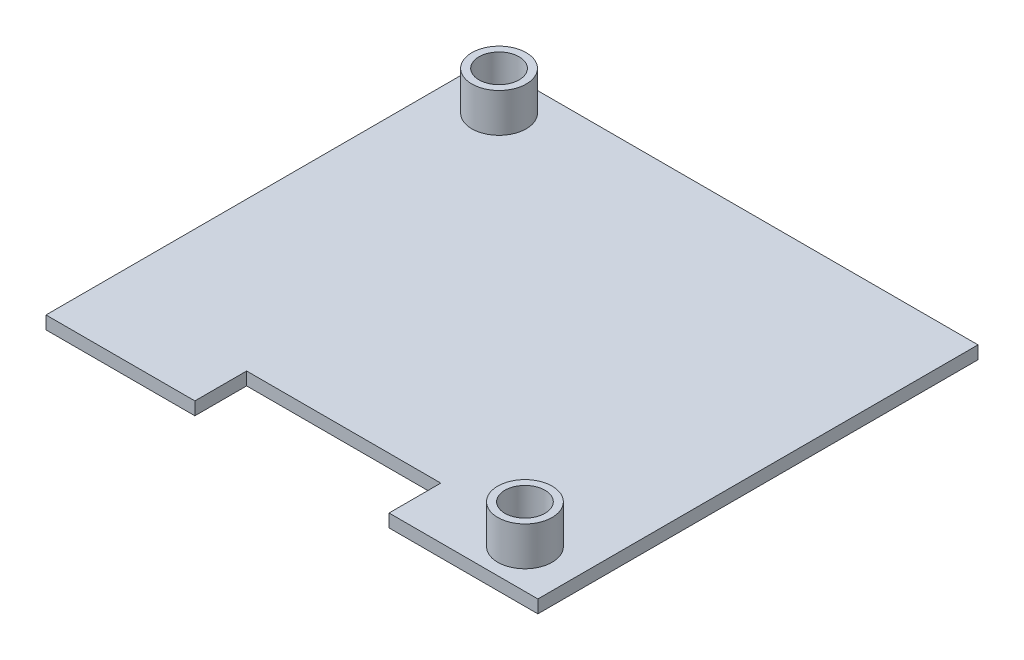
ISO-10303-21;
HEADER;
FILE_DESCRIPTION(('STEP AP214'),'2;1');
FILE_NAME('part.step','',(''),(''),'','','');
FILE_SCHEMA(('AUTOMOTIVE_DESIGN { 1 0 10303 214 1 1 1 1 }'));
ENDSEC;
DATA;
#1=APPLICATION_CONTEXT('core data for automotive mechanical design processes');
#2=APPLICATION_PROTOCOL_DEFINITION('international standard','automotive_design',2000,#1);
#3=PRODUCT_CONTEXT('',#1,'mechanical');
#4=PRODUCT('Part','Part','',(#3));
#5=PRODUCT_RELATED_PRODUCT_CATEGORY('part','',(#4));
#6=PRODUCT_DEFINITION_FORMATION('','',#4);
#7=PRODUCT_DEFINITION_CONTEXT('part definition',#1,'design');
#8=PRODUCT_DEFINITION('design','',#6,#7);
#9=PRODUCT_DEFINITION_SHAPE('','',#8);
#10=(LENGTH_UNIT() NAMED_UNIT(*) SI_UNIT(.MILLI.,.METRE.));
#11=(NAMED_UNIT(*) PLANE_ANGLE_UNIT() SI_UNIT($,.RADIAN.));
#12=(NAMED_UNIT(*) SI_UNIT($,.STERADIAN.) SOLID_ANGLE_UNIT());
#13=UNCERTAINTY_MEASURE_WITH_UNIT(LENGTH_MEASURE(1.E-05),#10,'distance_accuracy_value','');
#14=(GEOMETRIC_REPRESENTATION_CONTEXT(3) GLOBAL_UNCERTAINTY_ASSIGNED_CONTEXT((#13)) GLOBAL_UNIT_ASSIGNED_CONTEXT((#10,
#11,#12)) REPRESENTATION_CONTEXT('',''));
#15=CARTESIAN_POINT('',(0.,0.,0.));
#16=DIRECTION('',(0.,0.,1.));
#17=DIRECTION('',(1.,0.,0.));
#18=AXIS2_PLACEMENT_3D('',#15,#16,#17);
#19=CARTESIAN_POINT('',(-19.,1.,17.));
#20=DIRECTION('',(0.,0.,-1.));
#21=DIRECTION('',(-1.,0.,0.));
#22=AXIS2_PLACEMENT_3D('',#19,#20,#21);
#23=PLANE('',#22);
#24=DIRECTION('',(0.,-1.,0.));
#25=VECTOR('',#24,1.);
#26=CARTESIAN_POINT('',(7.5,4.001,17.));
#27=LINE('',#26,#25);
#28=CARTESIAN_POINT('',(7.5,1.,17.));
#29=VERTEX_POINT('',#28);
#30=CARTESIAN_POINT('',(7.5,0.,17.));
#31=VERTEX_POINT('',#30);
#32=EDGE_CURVE('E117',#29,#31,#27,.T.);
#33=ORIENTED_EDGE('',*,*,#32,.T.);
#34=DIRECTION('',(1.,0.,0.));
#35=VECTOR('',#34,1.);
#36=CARTESIAN_POINT('',(-19.,0.,17.));
#37=LINE('',#36,#35);
#38=CARTESIAN_POINT('',(19.,0.,17.));
#39=VERTEX_POINT('',#38);
#40=EDGE_CURVE('E88',#31,#39,#37,.T.);
#41=ORIENTED_EDGE('',*,*,#40,.T.);
#42=DIRECTION('',(0.,-1.,0.));
#43=VECTOR('',#42,1.);
#44=CARTESIAN_POINT('',(19.,1.,17.));
#45=LINE('',#44,#43);
#46=CARTESIAN_POINT('',(19.,1.,17.));
#47=VERTEX_POINT('',#46);
#48=EDGE_CURVE('E132',#47,#39,#45,.T.);
#49=ORIENTED_EDGE('',*,*,#48,.F.);
#50=DIRECTION('',(1.,0.,0.));
#51=VECTOR('',#50,1.);
#52=CARTESIAN_POINT('',(-19.,1.,17.));
#53=LINE('',#52,#51);
#54=EDGE_CURVE('E66',#29,#47,#53,.T.);
#55=ORIENTED_EDGE('',*,*,#54,.F.);
#56=EDGE_LOOP('',(#33,#41,#49,#55));
#57=FACE_BOUND('',#56,.T.);
#58=ADVANCED_FACE('F41',(#57),#23,.F.);
#59=CARTESIAN_POINT('',(0.,1.,0.));
#60=DIRECTION('',(0.,1.,0.));
#61=DIRECTION('',(0.,0.,1.));
#62=AXIS2_PLACEMENT_3D('',#59,#60,#61);
#63=PLANE('',#62);
#64=CARTESIAN_POINT('',(-15.,1.,-14.));
#65=DIRECTION('',(0.,1.,0.));
#66=DIRECTION('',(0.,0.,1.));
#67=AXIS2_PLACEMENT_3D('',#64,#65,#66);
#68=CIRCLE('',#67,2.1);
#69=CARTESIAN_POINT('',(-15.,1.,-11.9));
#70=VERTEX_POINT('',#69);
#71=EDGE_CURVE('E237',#70,#70,#68,.T.);
#72=ORIENTED_EDGE('',*,*,#71,.F.);
#73=EDGE_LOOP('',(#72));
#74=FACE_BOUND('',#73,.T.);
#75=CARTESIAN_POINT('',(15.,1.,14.));
#76=DIRECTION('',(0.,1.,0.));
#77=DIRECTION('',(0.,0.,1.));
#78=AXIS2_PLACEMENT_3D('',#75,#76,#77);
#79=CIRCLE('',#78,2.1);
#80=CARTESIAN_POINT('',(15.,1.,16.1));
#81=VERTEX_POINT('',#80);
#82=EDGE_CURVE('E251',#81,#81,#79,.T.);
#83=ORIENTED_EDGE('',*,*,#82,.F.);
#84=EDGE_LOOP('',(#83));
#85=FACE_BOUND('',#84,.T.);
#86=DIRECTION('',(1.,0.,0.));
#87=VECTOR('',#86,1.);
#88=CARTESIAN_POINT('',(0.,1.,13.));
#89=LINE('',#88,#87);
#90=CARTESIAN_POINT('',(-7.5,1.,13.));
#91=VERTEX_POINT('',#90);
#92=CARTESIAN_POINT('',(7.5,1.,13.));
#93=VERTEX_POINT('',#92);
#94=EDGE_CURVE('E129',#91,#93,#89,.T.);
#95=ORIENTED_EDGE('',*,*,#94,.T.);
#96=DIRECTION('',(0.,0.,-1.));
#97=VECTOR('',#96,1.);
#98=CARTESIAN_POINT('',(7.5,1.,0.));
#99=LINE('',#98,#97);
#100=EDGE_CURVE('E119',#29,#93,#99,.T.);
#101=ORIENTED_EDGE('',*,*,#100,.F.);
#102=ORIENTED_EDGE('',*,*,#54,.T.);
#103=DIRECTION('',(0.,0.,-1.));
#104=VECTOR('',#103,1.);
#105=CARTESIAN_POINT('',(19.,1.,-17.));
#106=LINE('',#105,#104);
#107=CARTESIAN_POINT('',(19.,1.,-17.));
#108=VERTEX_POINT('',#107);
#109=EDGE_CURVE('E159',#47,#108,#106,.T.);
#110=ORIENTED_EDGE('',*,*,#109,.T.);
#111=DIRECTION('',(-1.,0.,0.));
#112=VECTOR('',#111,1.);
#113=CARTESIAN_POINT('',(-19.,1.,-17.));
#114=LINE('',#113,#112);
#115=CARTESIAN_POINT('',(-19.,1.,-17.));
#116=VERTEX_POINT('',#115);
#117=EDGE_CURVE('E96',#108,#116,#114,.T.);
#118=ORIENTED_EDGE('',*,*,#117,.T.);
#119=DIRECTION('',(0.,0.,1.));
#120=VECTOR('',#119,1.);
#121=CARTESIAN_POINT('',(-19.,1.,-17.));
#122=LINE('',#121,#120);
#123=CARTESIAN_POINT('',(-19.,1.,17.));
#124=VERTEX_POINT('',#123);
#125=EDGE_CURVE('E136',#116,#124,#122,.T.);
#126=ORIENTED_EDGE('',*,*,#125,.T.);
#127=CARTESIAN_POINT('',(-7.5,1.,17.));
#128=VERTEX_POINT('',#127);
#129=EDGE_CURVE('E135',#124,#128,#53,.T.);
#130=ORIENTED_EDGE('',*,*,#129,.T.);
#131=DIRECTION('',(0.,0.,-1.));
#132=VECTOR('',#131,1.);
#133=CARTESIAN_POINT('',(-7.49999999999999,1.,0.));
#134=LINE('',#133,#132);
#135=EDGE_CURVE('E269',#128,#91,#134,.T.);
#136=ORIENTED_EDGE('',*,*,#135,.T.);
#137=EDGE_LOOP('',(#95,#101,#102,#110,#118,#126,#130,#136));
#138=FACE_BOUND('',#137,.T.);
#139=ADVANCED_FACE('F127',(#74,#85,#138),#63,.T.);
#140=CARTESIAN_POINT('',(0.,0.,0.));
#141=DIRECTION('',(0.,1.,0.));
#142=DIRECTION('',(0.,0.,1.));
#143=AXIS2_PLACEMENT_3D('',#140,#141,#142);
#144=PLANE('',#143);
#145=DIRECTION('',(0.,0.,-1.));
#146=VECTOR('',#145,1.);
#147=CARTESIAN_POINT('',(7.5,0.,0.));
#148=LINE('',#147,#146);
#149=CARTESIAN_POINT('',(7.5,0.,13.));
#150=VERTEX_POINT('',#149);
#151=EDGE_CURVE('E122',#31,#150,#148,.T.);
#152=ORIENTED_EDGE('',*,*,#151,.T.);
#153=DIRECTION('',(1.,0.,0.));
#154=VECTOR('',#153,1.);
#155=CARTESIAN_POINT('',(0.,0.,13.));
#156=LINE('',#155,#154);
#157=CARTESIAN_POINT('',(-7.5,0.,13.));
#158=VERTEX_POINT('',#157);
#159=EDGE_CURVE('E124',#158,#150,#156,.T.);
#160=ORIENTED_EDGE('',*,*,#159,.F.);
#161=DIRECTION('',(0.,0.,-1.));
#162=VECTOR('',#161,1.);
#163=CARTESIAN_POINT('',(-7.49999999999999,0.,0.));
#164=LINE('',#163,#162);
#165=CARTESIAN_POINT('',(-7.5,0.,17.));
#166=VERTEX_POINT('',#165);
#167=EDGE_CURVE('E224',#166,#158,#164,.T.);
#168=ORIENTED_EDGE('',*,*,#167,.F.);
#169=CARTESIAN_POINT('',(-19.,0.,17.));
#170=VERTEX_POINT('',#169);
#171=EDGE_CURVE('E155',#170,#166,#37,.T.);
#172=ORIENTED_EDGE('',*,*,#171,.F.);
#173=DIRECTION('',(0.,0.,1.));
#174=VECTOR('',#173,1.);
#175=CARTESIAN_POINT('',(-19.,0.,-17.));
#176=LINE('',#175,#174);
#177=CARTESIAN_POINT('',(-19.,0.,-17.));
#178=VERTEX_POINT('',#177);
#179=EDGE_CURVE('E152',#178,#170,#176,.T.);
#180=ORIENTED_EDGE('',*,*,#179,.F.);
#181=DIRECTION('',(-1.,0.,0.));
#182=VECTOR('',#181,1.);
#183=CARTESIAN_POINT('',(-19.,0.,-17.));
#184=LINE('',#183,#182);
#185=CARTESIAN_POINT('',(19.,0.,-17.));
#186=VERTEX_POINT('',#185);
#187=EDGE_CURVE('E148',#186,#178,#184,.T.);
#188=ORIENTED_EDGE('',*,*,#187,.F.);
#189=DIRECTION('',(0.,0.,-1.));
#190=VECTOR('',#189,1.);
#191=CARTESIAN_POINT('',(19.,0.,-17.));
#192=LINE('',#191,#190);
#193=EDGE_CURVE('E144',#39,#186,#192,.T.);
#194=ORIENTED_EDGE('',*,*,#193,.F.);
#195=ORIENTED_EDGE('',*,*,#40,.F.);
#196=EDGE_LOOP('',(#152,#160,#168,#172,#180,#188,#194,#195));
#197=FACE_BOUND('',#196,.T.);
#198=ADVANCED_FACE('F197',(#197),#144,.F.);
#199=CARTESIAN_POINT('',(19.,1.,-17.));
#200=DIRECTION('',(-1.,0.,0.));
#201=DIRECTION('',(0.,0.,1.));
#202=AXIS2_PLACEMENT_3D('',#199,#200,#201);
#203=PLANE('',#202);
#204=ORIENTED_EDGE('',*,*,#193,.T.);
#205=DIRECTION('',(0.,-1.,0.));
#206=VECTOR('',#205,1.);
#207=CARTESIAN_POINT('',(19.,1.,-17.));
#208=LINE('',#207,#206);
#209=EDGE_CURVE('E170',#108,#186,#208,.T.);
#210=ORIENTED_EDGE('',*,*,#209,.F.);
#211=ORIENTED_EDGE('',*,*,#109,.F.);
#212=ORIENTED_EDGE('',*,*,#48,.T.);
#213=EDGE_LOOP('',(#204,#210,#211,#212));
#214=FACE_BOUND('',#213,.T.);
#215=ADVANCED_FACE('F43',(#214),#203,.F.);
#216=CARTESIAN_POINT('',(-19.,1.,-17.));
#217=DIRECTION('',(0.,0.,1.));
#218=DIRECTION('',(1.,0.,0.));
#219=AXIS2_PLACEMENT_3D('',#216,#217,#218);
#220=PLANE('',#219);
#221=ORIENTED_EDGE('',*,*,#187,.T.);
#222=DIRECTION('',(0.,-1.,0.));
#223=VECTOR('',#222,1.);
#224=CARTESIAN_POINT('',(-19.,1.,-17.));
#225=LINE('',#224,#223);
#226=EDGE_CURVE('E166',#116,#178,#225,.T.);
#227=ORIENTED_EDGE('',*,*,#226,.F.);
#228=ORIENTED_EDGE('',*,*,#117,.F.);
#229=ORIENTED_EDGE('',*,*,#209,.T.);
#230=EDGE_LOOP('',(#221,#227,#228,#229));
#231=FACE_BOUND('',#230,.T.);
#232=ADVANCED_FACE('F216',(#231),#220,.F.);
#233=CARTESIAN_POINT('',(-19.,1.,-17.));
#234=DIRECTION('',(1.,0.,0.));
#235=DIRECTION('',(0.,0.,-1.));
#236=AXIS2_PLACEMENT_3D('',#233,#234,#235);
#237=PLANE('',#236);
#238=ORIENTED_EDGE('',*,*,#179,.T.);
#239=DIRECTION('',(0.,-1.,0.));
#240=VECTOR('',#239,1.);
#241=CARTESIAN_POINT('',(-19.,1.,17.));
#242=LINE('',#241,#240);
#243=EDGE_CURVE('E162',#124,#170,#242,.T.);
#244=ORIENTED_EDGE('',*,*,#243,.F.);
#245=ORIENTED_EDGE('',*,*,#125,.F.);
#246=ORIENTED_EDGE('',*,*,#226,.T.);
#247=EDGE_LOOP('',(#238,#244,#245,#246));
#248=FACE_BOUND('',#247,.T.);
#249=ADVANCED_FACE('F209',(#248),#237,.F.);
#250=ORIENTED_EDGE('',*,*,#171,.T.);
#251=DIRECTION('',(0.,-1.,0.));
#252=VECTOR('',#251,1.);
#253=CARTESIAN_POINT('',(-7.5,4.001,17.));
#254=LINE('',#253,#252);
#255=EDGE_CURVE('E57',#128,#166,#254,.T.);
#256=ORIENTED_EDGE('',*,*,#255,.F.);
#257=ORIENTED_EDGE('',*,*,#129,.F.);
#258=ORIENTED_EDGE('',*,*,#243,.T.);
#259=EDGE_LOOP('',(#250,#256,#257,#258));
#260=FACE_BOUND('',#259,.T.);
#261=ADVANCED_FACE('F204',(#260),#23,.F.);
#262=CARTESIAN_POINT('',(15.,4.,14.));
#263=DIRECTION('',(0.,-1.,0.));
#264=DIRECTION('',(0.,0.,-1.));
#265=AXIS2_PLACEMENT_3D('',#262,#263,#264);
#266=CYLINDRICAL_SURFACE('',#265,1.55);
#267=CARTESIAN_POINT('',(15.,4.,14.));
#268=DIRECTION('',(0.,1.,0.));
#269=DIRECTION('',(0.,0.,1.));
#270=AXIS2_PLACEMENT_3D('',#267,#268,#269);
#271=CIRCLE('',#270,1.55);
#272=CARTESIAN_POINT('',(15.,4.,15.55));
#273=VERTEX_POINT('',#272);
#274=EDGE_CURVE('E255',#273,#273,#271,.T.);
#275=ORIENTED_EDGE('',*,*,#274,.T.);
#276=EDGE_LOOP('',(#275));
#277=FACE_BOUND('',#276,.T.);
#278=CARTESIAN_POINT('',(15.,1.,14.));
#279=DIRECTION('',(0.,1.,0.));
#280=DIRECTION('',(0.,0.,1.));
#281=AXIS2_PLACEMENT_3D('',#278,#279,#280);
#282=CIRCLE('',#281,1.55);
#283=CARTESIAN_POINT('',(15.,1.,15.55));
#284=VERTEX_POINT('',#283);
#285=EDGE_CURVE('E50',#284,#284,#282,.F.);
#286=ORIENTED_EDGE('',*,*,#285,.T.);
#287=EDGE_LOOP('',(#286));
#288=FACE_BOUND('',#287,.T.);
#289=ADVANCED_FACE('F176',(#277,#288),#266,.F.);
#290=CARTESIAN_POINT('',(15.,4.,14.));
#291=DIRECTION('',(0.,-1.,0.));
#292=DIRECTION('',(0.,0.,-1.));
#293=AXIS2_PLACEMENT_3D('',#290,#291,#292);
#294=CYLINDRICAL_SURFACE('',#293,2.1);
#295=CARTESIAN_POINT('',(15.,4.,14.));
#296=DIRECTION('',(0.,1.,0.));
#297=DIRECTION('',(0.,0.,1.));
#298=AXIS2_PLACEMENT_3D('',#295,#296,#297);
#299=CIRCLE('',#298,2.1);
#300=CARTESIAN_POINT('',(15.,4.,16.1));
#301=VERTEX_POINT('',#300);
#302=EDGE_CURVE('E149',#301,#301,#299,.T.);
#303=ORIENTED_EDGE('',*,*,#302,.F.);
#304=EDGE_LOOP('',(#303));
#305=FACE_BOUND('',#304,.T.);
#306=ORIENTED_EDGE('',*,*,#82,.T.);
#307=EDGE_LOOP('',(#306));
#308=FACE_BOUND('',#307,.T.);
#309=ADVANCED_FACE('F191',(#305,#308),#294,.T.);
#310=CARTESIAN_POINT('',(0.,4.,0.));
#311=DIRECTION('',(0.,1.,0.));
#312=DIRECTION('',(0.,0.,1.));
#313=AXIS2_PLACEMENT_3D('',#310,#311,#312);
#314=PLANE('',#313);
#315=ORIENTED_EDGE('',*,*,#274,.F.);
#316=EDGE_LOOP('',(#315));
#317=FACE_BOUND('',#316,.T.);
#318=ORIENTED_EDGE('',*,*,#302,.T.);
#319=EDGE_LOOP('',(#318));
#320=FACE_BOUND('',#319,.T.);
#321=ADVANCED_FACE('F181',(#317,#320),#314,.T.);
#322=ORIENTED_EDGE('',*,*,#285,.F.);
#323=EDGE_LOOP('',(#322));
#324=FACE_BOUND('',#323,.T.);
#325=ADVANCED_FACE('F178',(#324),#63,.T.);
#326=CARTESIAN_POINT('',(-15.,4.,-14.));
#327=DIRECTION('',(0.,-1.,0.));
#328=DIRECTION('',(0.,0.,-1.));
#329=AXIS2_PLACEMENT_3D('',#326,#327,#328);
#330=CYLINDRICAL_SURFACE('',#329,2.1);
#331=CARTESIAN_POINT('',(-15.,4.,-14.));
#332=DIRECTION('',(0.,1.,0.));
#333=DIRECTION('',(0.,0.,1.));
#334=AXIS2_PLACEMENT_3D('',#331,#332,#333);
#335=CIRCLE('',#334,2.1);
#336=CARTESIAN_POINT('',(-15.,4.,-11.9));
#337=VERTEX_POINT('',#336);
#338=EDGE_CURVE('E243',#337,#337,#335,.T.);
#339=ORIENTED_EDGE('',*,*,#338,.F.);
#340=EDGE_LOOP('',(#339));
#341=FACE_BOUND('',#340,.T.);
#342=ORIENTED_EDGE('',*,*,#71,.T.);
#343=EDGE_LOOP('',(#342));
#344=FACE_BOUND('',#343,.T.);
#345=ADVANCED_FACE('F180',(#341,#344),#330,.T.);
#346=CARTESIAN_POINT('',(-15.,4.,-14.));
#347=DIRECTION('',(0.,-1.,0.));
#348=DIRECTION('',(0.,0.,-1.));
#349=AXIS2_PLACEMENT_3D('',#346,#347,#348);
#350=CYLINDRICAL_SURFACE('',#349,1.55);
#351=CARTESIAN_POINT('',(-15.,4.,-14.));
#352=DIRECTION('',(0.,1.,0.));
#353=DIRECTION('',(0.,0.,1.));
#354=AXIS2_PLACEMENT_3D('',#351,#352,#353);
#355=CIRCLE('',#354,1.55);
#356=CARTESIAN_POINT('',(-15.,4.,-12.45));
#357=VERTEX_POINT('',#356);
#358=EDGE_CURVE('E247',#357,#357,#355,.T.);
#359=ORIENTED_EDGE('',*,*,#358,.T.);
#360=EDGE_LOOP('',(#359));
#361=FACE_BOUND('',#360,.T.);
#362=CARTESIAN_POINT('',(-15.,1.,-14.));
#363=DIRECTION('',(0.,1.,0.));
#364=DIRECTION('',(0.,0.,1.));
#365=AXIS2_PLACEMENT_3D('',#362,#363,#364);
#366=CIRCLE('',#365,1.55);
#367=CARTESIAN_POINT('',(-15.,1.,-12.45));
#368=VERTEX_POINT('',#367);
#369=EDGE_CURVE('E11',#368,#368,#366,.F.);
#370=ORIENTED_EDGE('',*,*,#369,.T.);
#371=EDGE_LOOP('',(#370));
#372=FACE_BOUND('',#371,.T.);
#373=ADVANCED_FACE('F188',(#361,#372),#350,.F.);
#374=CARTESIAN_POINT('',(0.,4.,0.));
#375=DIRECTION('',(0.,1.,0.));
#376=DIRECTION('',(0.,0.,1.));
#377=AXIS2_PLACEMENT_3D('',#374,#375,#376);
#378=PLANE('',#377);
#379=ORIENTED_EDGE('',*,*,#338,.T.);
#380=EDGE_LOOP('',(#379));
#381=FACE_BOUND('',#380,.T.);
#382=ORIENTED_EDGE('',*,*,#358,.F.);
#383=EDGE_LOOP('',(#382));
#384=FACE_BOUND('',#383,.T.);
#385=ADVANCED_FACE('F200',(#381,#384),#378,.T.);
#386=ORIENTED_EDGE('',*,*,#369,.F.);
#387=EDGE_LOOP('',(#386));
#388=FACE_BOUND('',#387,.T.);
#389=ADVANCED_FACE('F183',(#388),#63,.T.);
#390=CARTESIAN_POINT('',(7.5,4.001,0.));
#391=DIRECTION('',(-1.,0.,0.));
#392=DIRECTION('',(0.,0.,1.));
#393=AXIS2_PLACEMENT_3D('',#390,#391,#392);
#394=PLANE('',#393);
#395=ORIENTED_EDGE('',*,*,#100,.T.);
#396=DIRECTION('',(0.,-1.,0.));
#397=VECTOR('',#396,1.);
#398=CARTESIAN_POINT('',(7.5,4.001,13.));
#399=LINE('',#398,#397);
#400=EDGE_CURVE('E234',#93,#150,#399,.T.);
#401=ORIENTED_EDGE('',*,*,#400,.T.);
#402=ORIENTED_EDGE('',*,*,#151,.F.);
#403=ORIENTED_EDGE('',*,*,#32,.F.);
#404=EDGE_LOOP('',(#395,#401,#402,#403));
#405=FACE_BOUND('',#404,.T.);
#406=ADVANCED_FACE('F118',(#405),#394,.T.);
#407=CARTESIAN_POINT('',(0.,4.001,13.));
#408=DIRECTION('',(0.,0.,-1.));
#409=DIRECTION('',(-1.,0.,0.));
#410=AXIS2_PLACEMENT_3D('',#407,#408,#409);
#411=PLANE('',#410);
#412=DIRECTION('',(0.,-1.,0.));
#413=VECTOR('',#412,1.);
#414=CARTESIAN_POINT('',(-7.5,4.001,13.));
#415=LINE('',#414,#413);
#416=EDGE_CURVE('E238',#91,#158,#415,.T.);
#417=ORIENTED_EDGE('',*,*,#416,.T.);
#418=ORIENTED_EDGE('',*,*,#159,.T.);
#419=ORIENTED_EDGE('',*,*,#400,.F.);
#420=ORIENTED_EDGE('',*,*,#94,.F.);
#421=EDGE_LOOP('',(#417,#418,#419,#420));
#422=FACE_BOUND('',#421,.T.);
#423=ADVANCED_FACE('F276',(#422),#411,.F.);
#424=CARTESIAN_POINT('',(-7.49999999999999,4.001,0.));
#425=DIRECTION('',(-1.,0.,0.));
#426=DIRECTION('',(0.,0.,1.));
#427=AXIS2_PLACEMENT_3D('',#424,#425,#426);
#428=PLANE('',#427);
#429=ORIENTED_EDGE('',*,*,#255,.T.);
#430=ORIENTED_EDGE('',*,*,#167,.T.);
#431=ORIENTED_EDGE('',*,*,#416,.F.);
#432=ORIENTED_EDGE('',*,*,#135,.F.);
#433=EDGE_LOOP('',(#429,#430,#431,#432));
#434=FACE_BOUND('',#433,.T.);
#435=ADVANCED_FACE('F274',(#434),#428,.F.);
#436=CLOSED_SHELL('',(#58,#139,#198,#215,#232,#249,#261,#289,#309,#321,#325,#345,#373,#385,#389,
#406,#423,#435));
#437=MANIFOLD_SOLID_BREP('B2',#436);
#438=ADVANCED_BREP_SHAPE_REPRESENTATION('',(#18,#437),#14);
#439=SHAPE_DEFINITION_REPRESENTATION(#9,#438);
ENDSEC;
END-ISO-10303-21;
